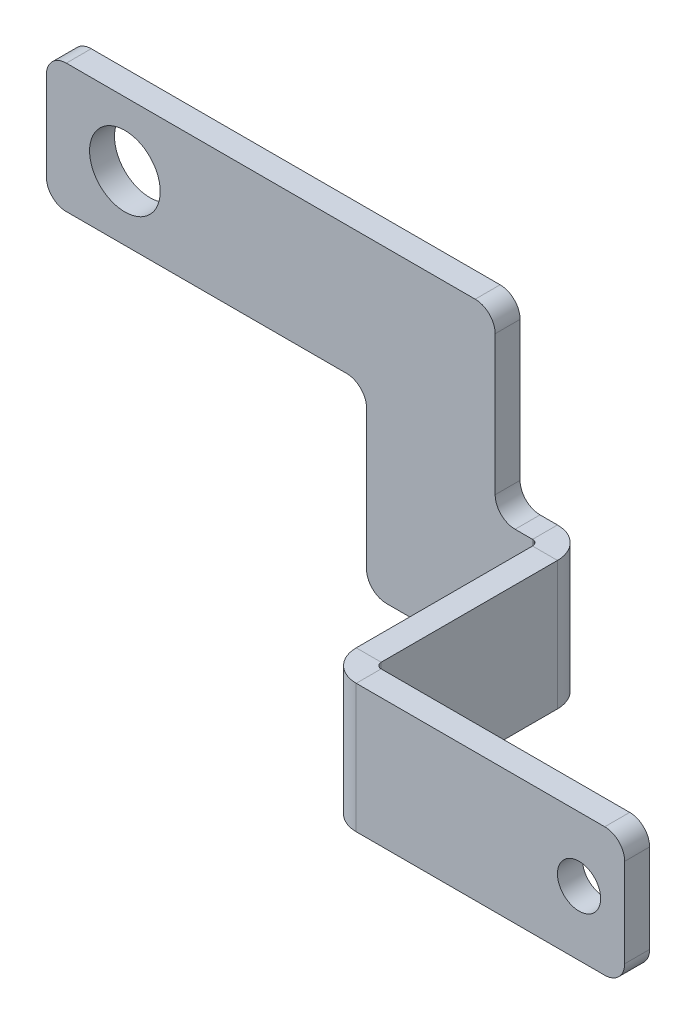
ISO-10303-21;
HEADER;
FILE_DESCRIPTION(('STEP AP214'),'2;1');
FILE_NAME('part.step','',(''),(''),'','','');
FILE_SCHEMA(('AUTOMOTIVE_DESIGN { 1 0 10303 214 1 1 1 1 }'));
ENDSEC;
DATA;
#1=APPLICATION_CONTEXT('core data for automotive mechanical design processes');
#2=APPLICATION_PROTOCOL_DEFINITION('international standard','automotive_design',2000,#1);
#3=PRODUCT_CONTEXT('',#1,'mechanical');
#4=PRODUCT('Part','Part','',(#3));
#5=PRODUCT_RELATED_PRODUCT_CATEGORY('part','',(#4));
#6=PRODUCT_DEFINITION_FORMATION('','',#4);
#7=PRODUCT_DEFINITION_CONTEXT('part definition',#1,'design');
#8=PRODUCT_DEFINITION('design','',#6,#7);
#9=PRODUCT_DEFINITION_SHAPE('','',#8);
#10=(LENGTH_UNIT() NAMED_UNIT(*) SI_UNIT(.MILLI.,.METRE.));
#11=(NAMED_UNIT(*) PLANE_ANGLE_UNIT() SI_UNIT($,.RADIAN.));
#12=(NAMED_UNIT(*) SI_UNIT($,.STERADIAN.) SOLID_ANGLE_UNIT());
#13=UNCERTAINTY_MEASURE_WITH_UNIT(LENGTH_MEASURE(1.E-05),#10,'distance_accuracy_value','');
#14=(GEOMETRIC_REPRESENTATION_CONTEXT(3) GLOBAL_UNCERTAINTY_ASSIGNED_CONTEXT((#13)) GLOBAL_UNIT_ASSIGNED_CONTEXT((#10,
#11,#12)) REPRESENTATION_CONTEXT('',''));
#15=CARTESIAN_POINT('',(0.,0.,0.));
#16=DIRECTION('',(0.,0.,1.));
#17=DIRECTION('',(1.,0.,0.));
#18=AXIS2_PLACEMENT_3D('',#15,#16,#17);
#19=CARTESIAN_POINT('',(65.8241,-39.2125999999912,0.));
#20=DIRECTION('',(0.,1.,0.));
#21=DIRECTION('',(-1.,0.,0.));
#22=AXIS2_PLACEMENT_3D('',#19,#20,#21);
#23=PLANE('',#22);
#24=DIRECTION('',(-1.,0.,0.));
#25=VECTOR('',#24,1.);
#26=CARTESIAN_POINT('',(65.8241000000001,-39.2125999999912,23.1902));
#27=LINE('',#26,#25);
#28=CARTESIAN_POINT('',(65.8241000000001,-39.2125999999912,23.1902));
#29=VERTEX_POINT('',#28);
#30=CARTESIAN_POINT('',(62.6491000000001,-39.2125999999912,23.1902));
#31=VERTEX_POINT('',#30);
#32=EDGE_CURVE('E269',#29,#31,#27,.T.);
#33=ORIENTED_EDGE('',*,*,#32,.T.);
#34=DIRECTION('',(0.,0.,1.));
#35=VECTOR('',#34,1.);
#36=CARTESIAN_POINT('',(62.6491,-39.2125999999912,0.));
#37=LINE('',#36,#35);
#38=CARTESIAN_POINT('',(62.6491,-39.2125999999912,0.736599999999997));
#39=VERTEX_POINT('',#38);
#40=EDGE_CURVE('E290',#31,#39,#37,.F.);
#41=ORIENTED_EDGE('',*,*,#40,.T.);
#42=DIRECTION('',(-1.,0.,0.));
#43=VECTOR('',#42,1.);
#44=CARTESIAN_POINT('',(65.8241,-39.2125999999912,0.736599999999986));
#45=LINE('',#44,#43);
#46=CARTESIAN_POINT('',(65.8241,-39.2125999999912,0.736599999999986));
#47=VERTEX_POINT('',#46);
#48=EDGE_CURVE('E279',#39,#47,#45,.F.);
#49=ORIENTED_EDGE('',*,*,#48,.T.);
#50=DIRECTION('',(0.,0.,-1.));
#51=VECTOR('',#50,1.);
#52=CARTESIAN_POINT('',(65.8241,-39.2125999999912,-2.26544738483615E-13));
#53=LINE('',#52,#51);
#54=EDGE_CURVE('E285',#29,#47,#53,.T.);
#55=ORIENTED_EDGE('',*,*,#54,.F.);
#56=EDGE_LOOP('',(#33,#41,#49,#55));
#57=FACE_BOUND('',#56,.T.);
#58=ADVANCED_FACE('F58',(#57),#23,.F.);
#59=CARTESIAN_POINT('',(65.8241000000001,-22.8345999999912,23.9268));
#60=DIRECTION('',(0.,-1.,0.));
#61=DIRECTION('',(1.,0.,0.));
#62=AXIS2_PLACEMENT_3D('',#59,#60,#61);
#63=PLANE('',#62);
#64=DIRECTION('',(-1.,0.,0.));
#65=VECTOR('',#64,1.);
#66=CARTESIAN_POINT('',(65.8241000000001,-22.8345999999912,23.1902));
#67=LINE('',#66,#65);
#68=CARTESIAN_POINT('',(65.8241000000001,-22.8345999999912,23.1902));
#69=VERTEX_POINT('',#68);
#70=CARTESIAN_POINT('',(62.6491000000001,-22.8345999999912,23.1902));
#71=VERTEX_POINT('',#70);
#72=EDGE_CURVE('E276',#69,#71,#67,.T.);
#73=ORIENTED_EDGE('',*,*,#72,.F.);
#74=DIRECTION('',(0.,0.,1.));
#75=VECTOR('',#74,1.);
#76=CARTESIAN_POINT('',(65.8241,-22.8345999999912,-2.2985581365326E-13));
#77=LINE('',#76,#75);
#78=CARTESIAN_POINT('',(65.8241,-22.8345999999912,0.736599999999986));
#79=VERTEX_POINT('',#78);
#80=EDGE_CURVE('E281',#79,#69,#77,.T.);
#81=ORIENTED_EDGE('',*,*,#80,.F.);
#82=DIRECTION('',(-1.,0.,0.));
#83=VECTOR('',#82,1.);
#84=CARTESIAN_POINT('',(62.6491,-22.8345999999912,0.736599999999997));
#85=LINE('',#84,#83);
#86=CARTESIAN_POINT('',(62.6491,-22.8345999999912,0.736599999999997));
#87=VERTEX_POINT('',#86);
#88=EDGE_CURVE('E295',#87,#79,#85,.F.);
#89=ORIENTED_EDGE('',*,*,#88,.F.);
#90=DIRECTION('',(0.,0.,-1.));
#91=VECTOR('',#90,1.);
#92=CARTESIAN_POINT('',(62.6491000000001,-22.8345999999912,23.9268));
#93=LINE('',#92,#91);
#94=EDGE_CURVE('E287',#87,#71,#93,.F.);
#95=ORIENTED_EDGE('',*,*,#94,.T.);
#96=EDGE_LOOP('',(#73,#81,#89,#95));
#97=FACE_BOUND('',#96,.T.);
#98=ADVANCED_FACE('F470',(#97),#63,.F.);
#99=CARTESIAN_POINT('',(65.8241,0.,-2.26544738483615E-13));
#100=DIRECTION('',(-1.,0.,0.));
#101=DIRECTION('',(0.,0.,1.));
#102=AXIS2_PLACEMENT_3D('',#99,#100,#101);
#103=PLANE('',#102);
#104=DIRECTION('',(0.,-1.,0.));
#105=VECTOR('',#104,1.);
#106=CARTESIAN_POINT('',(65.8241000000001,-39.2125999999912,23.1902));
#107=LINE('',#106,#105);
#108=EDGE_CURVE('E273',#29,#69,#107,.F.);
#109=ORIENTED_EDGE('',*,*,#108,.F.);
#110=ORIENTED_EDGE('',*,*,#54,.T.);
#111=DIRECTION('',(0.,1.,0.));
#112=VECTOR('',#111,1.);
#113=CARTESIAN_POINT('',(65.8241,-39.2125999999912,0.736599999999986));
#114=LINE('',#113,#112);
#115=EDGE_CURVE('E292',#79,#47,#114,.F.);
#116=ORIENTED_EDGE('',*,*,#115,.F.);
#117=ORIENTED_EDGE('',*,*,#80,.T.);
#118=EDGE_LOOP('',(#109,#110,#116,#117));
#119=FACE_BOUND('',#118,.T.);
#120=ADVANCED_FACE('F465',(#119),#103,.F.);
#121=CARTESIAN_POINT('',(62.6491,0.,-2.15459285232788E-13));
#122=DIRECTION('',(-1.,0.,0.));
#123=DIRECTION('',(0.,0.,1.));
#124=AXIS2_PLACEMENT_3D('',#121,#122,#123);
#125=PLANE('',#124);
#126=ORIENTED_EDGE('',*,*,#40,.F.);
#127=DIRECTION('',(0.,-1.,0.));
#128=VECTOR('',#127,1.);
#129=CARTESIAN_POINT('',(62.6491000000001,-39.2125999999912,23.1902));
#130=LINE('',#129,#128);
#131=EDGE_CURVE('E226',#31,#71,#130,.F.);
#132=ORIENTED_EDGE('',*,*,#131,.T.);
#133=ORIENTED_EDGE('',*,*,#94,.F.);
#134=DIRECTION('',(0.,1.,0.));
#135=VECTOR('',#134,1.);
#136=CARTESIAN_POINT('',(62.6491,-39.2125999999912,0.736599999999997));
#137=LINE('',#136,#135);
#138=EDGE_CURVE('E298',#39,#87,#137,.T.);
#139=ORIENTED_EDGE('',*,*,#138,.F.);
#140=EDGE_LOOP('',(#126,#132,#133,#139));
#141=FACE_BOUND('',#140,.T.);
#142=ADVANCED_FACE('F479',(#141),#125,.T.);
#143=CARTESIAN_POINT('',(0.,0.,-3.175));
#144=DIRECTION('',(-1.,0.,0.));
#145=DIRECTION('',(0.,-1.,0.));
#146=AXIS2_PLACEMENT_3D('',#143,#144,#145);
#147=PLANE('',#146);
#148=DIRECTION('',(0.,-1.,0.));
#149=VECTOR('',#148,1.);
#150=CARTESIAN_POINT('',(0.,0.,-3.175));
#151=LINE('',#150,#149);
#152=CARTESIAN_POINT('',(0.,-2.54,-3.175));
#153=VERTEX_POINT('',#152);
#154=CARTESIAN_POINT('',(0.,-13.838,-3.175));
#155=VERTEX_POINT('',#154);
#156=EDGE_CURVE('E320',#153,#155,#151,.T.);
#157=ORIENTED_EDGE('',*,*,#156,.T.);
#158=DIRECTION('',(0.,0.,1.));
#159=VECTOR('',#158,1.);
#160=CARTESIAN_POINT('',(0.,-13.838,-3.175));
#161=LINE('',#160,#159);
#162=CARTESIAN_POINT('',(0.,-13.838,0.));
#163=VERTEX_POINT('',#162);
#164=EDGE_CURVE('E399',#155,#163,#161,.T.);
#165=ORIENTED_EDGE('',*,*,#164,.T.);
#166=DIRECTION('',(0.,-1.,0.));
#167=VECTOR('',#166,1.);
#168=CARTESIAN_POINT('',(0.,0.,0.));
#169=LINE('',#168,#167);
#170=CARTESIAN_POINT('',(0.,-2.54,0.));
#171=VERTEX_POINT('',#170);
#172=EDGE_CURVE('E319',#171,#163,#169,.T.);
#173=ORIENTED_EDGE('',*,*,#172,.F.);
#174=DIRECTION('',(0.,0.,1.));
#175=VECTOR('',#174,1.);
#176=CARTESIAN_POINT('',(0.,-2.54,-3.175));
#177=LINE('',#176,#175);
#178=EDGE_CURVE('E397',#171,#153,#177,.F.);
#179=ORIENTED_EDGE('',*,*,#178,.T.);
#180=EDGE_LOOP('',(#157,#165,#173,#179));
#181=FACE_BOUND('',#180,.T.);
#182=ADVANCED_FACE('F520',(#181),#147,.T.);
#183=CARTESIAN_POINT('',(0.,0.,-3.175));
#184=DIRECTION('',(0.,1.,0.));
#185=DIRECTION('',(0.,0.,1.));
#186=AXIS2_PLACEMENT_3D('',#183,#184,#185);
#187=PLANE('',#186);
#188=DIRECTION('',(-1.,0.,0.));
#189=VECTOR('',#188,1.);
#190=CARTESIAN_POINT('',(0.,0.,-3.175));
#191=LINE('',#190,#189);
#192=CARTESIAN_POINT('',(54.61,0.,-3.175));
#193=VERTEX_POINT('',#192);
#194=CARTESIAN_POINT('',(2.54,0.,-3.175));
#195=VERTEX_POINT('',#194);
#196=EDGE_CURVE('E340',#193,#195,#191,.T.);
#197=ORIENTED_EDGE('',*,*,#196,.T.);
#198=DIRECTION('',(0.,0.,1.));
#199=VECTOR('',#198,1.);
#200=CARTESIAN_POINT('',(2.54,0.,-3.175));
#201=LINE('',#200,#199);
#202=CARTESIAN_POINT('',(2.54,0.,0.));
#203=VERTEX_POINT('',#202);
#204=EDGE_CURVE('E420',#195,#203,#201,.T.);
#205=ORIENTED_EDGE('',*,*,#204,.T.);
#206=DIRECTION('',(-1.,0.,0.));
#207=VECTOR('',#206,1.);
#208=CARTESIAN_POINT('',(0.,0.,0.));
#209=LINE('',#208,#207);
#210=CARTESIAN_POINT('',(54.61,0.,0.));
#211=VERTEX_POINT('',#210);
#212=EDGE_CURVE('E324',#211,#203,#209,.T.);
#213=ORIENTED_EDGE('',*,*,#212,.F.);
#214=DIRECTION('',(0.,0.,1.));
#215=VECTOR('',#214,1.);
#216=CARTESIAN_POINT('',(54.61,0.,-3.175));
#217=LINE('',#216,#215);
#218=EDGE_CURVE('E418',#211,#193,#217,.F.);
#219=ORIENTED_EDGE('',*,*,#218,.T.);
#220=EDGE_LOOP('',(#197,#205,#213,#219));
#221=FACE_BOUND('',#220,.T.);
#222=ADVANCED_FACE('F524',(#221),#187,.T.);
#223=CARTESIAN_POINT('',(57.15,0.,-3.175));
#224=DIRECTION('',(1.,0.,0.));
#225=DIRECTION('',(0.,0.,-1.));
#226=AXIS2_PLACEMENT_3D('',#223,#224,#225);
#227=PLANE('',#226);
#228=DIRECTION('',(0.,1.,0.));
#229=VECTOR('',#228,1.);
#230=CARTESIAN_POINT('',(57.15,-16.378,-3.175));
#231=LINE('',#230,#229);
#232=CARTESIAN_POINT('',(57.15,-20.2945999999912,-3.175));
#233=VERTEX_POINT('',#232);
#234=CARTESIAN_POINT('',(57.15,-2.54,-3.175));
#235=VERTEX_POINT('',#234);
#236=EDGE_CURVE('E337',#233,#235,#231,.T.);
#237=ORIENTED_EDGE('',*,*,#236,.T.);
#238=DIRECTION('',(0.,0.,1.));
#239=VECTOR('',#238,1.);
#240=CARTESIAN_POINT('',(57.15,-2.54,-3.175));
#241=LINE('',#240,#239);
#242=CARTESIAN_POINT('',(57.15,-2.54,0.));
#243=VERTEX_POINT('',#242);
#244=EDGE_CURVE('E425',#235,#243,#241,.T.);
#245=ORIENTED_EDGE('',*,*,#244,.T.);
#246=DIRECTION('',(0.,1.,0.));
#247=VECTOR('',#246,1.);
#248=CARTESIAN_POINT('',(57.15,0.,0.));
#249=LINE('',#248,#247);
#250=CARTESIAN_POINT('',(57.15,-20.2945999999912,0.));
#251=VERTEX_POINT('',#250);
#252=EDGE_CURVE('E360',#251,#243,#249,.T.);
#253=ORIENTED_EDGE('',*,*,#252,.F.);
#254=DIRECTION('',(0.,0.,1.));
#255=VECTOR('',#254,1.);
#256=CARTESIAN_POINT('',(57.15,-20.2945999999912,-3.175));
#257=LINE('',#256,#255);
#258=EDGE_CURVE('E423',#251,#233,#257,.F.);
#259=ORIENTED_EDGE('',*,*,#258,.T.);
#260=EDGE_LOOP('',(#237,#245,#253,#259));
#261=FACE_BOUND('',#260,.T.);
#262=ADVANCED_FACE('F442',(#261),#227,.T.);
#263=CARTESIAN_POINT('',(57.15,-22.8345999999912,-3.175));
#264=DIRECTION('',(0.,1.,0.));
#265=DIRECTION('',(0.,0.,1.));
#266=AXIS2_PLACEMENT_3D('',#263,#264,#265);
#267=PLANE('',#266);
#268=DIRECTION('',(-1.,0.,0.));
#269=VECTOR('',#268,1.);
#270=CARTESIAN_POINT('',(57.15,-22.8345999999912,-3.175));
#271=LINE('',#270,#269);
#272=CARTESIAN_POINT('',(61.9125,-22.8345999999912,-3.17500000000002));
#273=VERTEX_POINT('',#272);
#274=CARTESIAN_POINT('',(59.69,-22.8345999999912,-3.175));
#275=VERTEX_POINT('',#274);
#276=EDGE_CURVE('E335',#273,#275,#271,.T.);
#277=ORIENTED_EDGE('',*,*,#276,.T.);
#278=DIRECTION('',(0.,0.,1.));
#279=VECTOR('',#278,1.);
#280=CARTESIAN_POINT('',(59.69,-22.8345999999912,0.));
#281=LINE('',#280,#279);
#282=CARTESIAN_POINT('',(59.69,-22.8345999999912,0.));
#283=VERTEX_POINT('',#282);
#284=EDGE_CURVE('E428',#275,#283,#281,.T.);
#285=ORIENTED_EDGE('',*,*,#284,.T.);
#286=DIRECTION('',(-1.,0.,0.));
#287=VECTOR('',#286,1.);
#288=CARTESIAN_POINT('',(57.15,-22.8345999999912,0.));
#289=LINE('',#288,#287);
#290=CARTESIAN_POINT('',(61.9125,-22.8345999999912,0.));
#291=VERTEX_POINT('',#290);
#292=EDGE_CURVE('E357',#291,#283,#289,.T.);
#293=ORIENTED_EDGE('',*,*,#292,.F.);
#294=DIRECTION('',(0.,0.,1.));
#295=VECTOR('',#294,1.);
#296=CARTESIAN_POINT('',(61.9125,-22.8345999999912,-3.175));
#297=LINE('',#296,#295);
#298=EDGE_CURVE('E365',#273,#291,#297,.T.);
#299=ORIENTED_EDGE('',*,*,#298,.F.);
#300=EDGE_LOOP('',(#277,#285,#293,#299));
#301=FACE_BOUND('',#300,.T.);
#302=ADVANCED_FACE('F446',(#301),#267,.T.);
#303=CARTESIAN_POINT('',(57.15,-39.2125999999912,-3.175));
#304=DIRECTION('',(0.,-1.,0.));
#305=DIRECTION('',(0.,0.,-1.));
#306=AXIS2_PLACEMENT_3D('',#303,#304,#305);
#307=PLANE('',#306);
#308=DIRECTION('',(1.,0.,0.));
#309=VECTOR('',#308,1.);
#310=CARTESIAN_POINT('',(57.15,-39.2125999999912,0.));
#311=LINE('',#310,#309);
#312=CARTESIAN_POINT('',(43.312,-39.2125999999912,0.));
#313=VERTEX_POINT('',#312);
#314=CARTESIAN_POINT('',(61.9125,-39.2125999999912,0.));
#315=VERTEX_POINT('',#314);
#316=EDGE_CURVE('E352',#313,#315,#311,.T.);
#317=ORIENTED_EDGE('',*,*,#316,.F.);
#318=DIRECTION('',(0.,0.,1.));
#319=VECTOR('',#318,1.);
#320=CARTESIAN_POINT('',(43.312,-39.2125999999912,-3.175));
#321=LINE('',#320,#319);
#322=CARTESIAN_POINT('',(43.312,-39.2125999999912,-3.175));
#323=VERTEX_POINT('',#322);
#324=EDGE_CURVE('E73',#313,#323,#321,.F.);
#325=ORIENTED_EDGE('',*,*,#324,.T.);
#326=DIRECTION('',(1.,0.,0.));
#327=VECTOR('',#326,1.);
#328=CARTESIAN_POINT('',(57.15,-39.2125999999912,-3.175));
#329=LINE('',#328,#327);
#330=CARTESIAN_POINT('',(61.9125,-39.2125999999912,-3.175));
#331=VERTEX_POINT('',#330);
#332=EDGE_CURVE('E330',#323,#331,#329,.T.);
#333=ORIENTED_EDGE('',*,*,#332,.T.);
#334=DIRECTION('',(0.,0.,1.));
#335=VECTOR('',#334,1.);
#336=CARTESIAN_POINT('',(61.9125,-39.2125999999912,-3.175));
#337=LINE('',#336,#335);
#338=EDGE_CURVE('E343',#331,#315,#337,.T.);
#339=ORIENTED_EDGE('',*,*,#338,.T.);
#340=EDGE_LOOP('',(#317,#325,#333,#339));
#341=FACE_BOUND('',#340,.T.);
#342=ADVANCED_FACE('F589',(#341),#307,.T.);
#343=CARTESIAN_POINT('',(40.772,-16.378,-3.175));
#344=DIRECTION('',(-1.,0.,0.));
#345=DIRECTION('',(0.,0.,1.));
#346=AXIS2_PLACEMENT_3D('',#343,#344,#345);
#347=PLANE('',#346);
#348=DIRECTION('',(0.,-1.,0.));
#349=VECTOR('',#348,1.);
#350=CARTESIAN_POINT('',(40.772,-16.378,0.));
#351=LINE('',#350,#349);
#352=CARTESIAN_POINT('',(40.772,-18.918,0.));
#353=VERTEX_POINT('',#352);
#354=CARTESIAN_POINT('',(40.772,-36.6725999999912,0.));
#355=VERTEX_POINT('',#354);
#356=EDGE_CURVE('E349',#353,#355,#351,.T.);
#357=ORIENTED_EDGE('',*,*,#356,.F.);
#358=DIRECTION('',(0.,0.,1.));
#359=VECTOR('',#358,1.);
#360=CARTESIAN_POINT('',(40.772,-18.918,-3.175));
#361=LINE('',#360,#359);
#362=CARTESIAN_POINT('',(40.772,-18.918,-3.175));
#363=VERTEX_POINT('',#362);
#364=EDGE_CURVE('E378',#353,#363,#361,.F.);
#365=ORIENTED_EDGE('',*,*,#364,.T.);
#366=DIRECTION('',(0.,-1.,0.));
#367=VECTOR('',#366,1.);
#368=CARTESIAN_POINT('',(40.772,-16.378,-3.175));
#369=LINE('',#368,#367);
#370=CARTESIAN_POINT('',(40.772,-36.6725999999912,-3.175));
#371=VERTEX_POINT('',#370);
#372=EDGE_CURVE('E327',#363,#371,#369,.T.);
#373=ORIENTED_EDGE('',*,*,#372,.T.);
#374=DIRECTION('',(0.,0.,1.));
#375=VECTOR('',#374,1.);
#376=CARTESIAN_POINT('',(40.772,-36.6725999999912,-3.175));
#377=LINE('',#376,#375);
#378=EDGE_CURVE('E375',#371,#355,#377,.T.);
#379=ORIENTED_EDGE('',*,*,#378,.T.);
#380=EDGE_LOOP('',(#357,#365,#373,#379));
#381=FACE_BOUND('',#380,.T.);
#382=ADVANCED_FACE('F572',(#381),#347,.T.);
#383=CARTESIAN_POINT('',(0.,-16.378,-3.175));
#384=DIRECTION('',(0.,-1.,0.));
#385=DIRECTION('',(0.,0.,-1.));
#386=AXIS2_PLACEMENT_3D('',#383,#384,#385);
#387=PLANE('',#386);
#388=DIRECTION('',(1.,0.,0.));
#389=VECTOR('',#388,1.);
#390=CARTESIAN_POINT('',(0.,-16.378,-3.175));
#391=LINE('',#390,#389);
#392=CARTESIAN_POINT('',(2.54,-16.378,-3.175));
#393=VERTEX_POINT('',#392);
#394=CARTESIAN_POINT('',(38.232,-16.378,-3.175));
#395=VERTEX_POINT('',#394);
#396=EDGE_CURVE('E323',#393,#395,#391,.T.);
#397=ORIENTED_EDGE('',*,*,#396,.T.);
#398=DIRECTION('',(0.,0.,1.));
#399=VECTOR('',#398,1.);
#400=CARTESIAN_POINT('',(38.232,-16.378,0.));
#401=LINE('',#400,#399);
#402=CARTESIAN_POINT('',(38.232,-16.378,0.));
#403=VERTEX_POINT('',#402);
#404=EDGE_CURVE('E372',#395,#403,#401,.T.);
#405=ORIENTED_EDGE('',*,*,#404,.T.);
#406=DIRECTION('',(1.,0.,0.));
#407=VECTOR('',#406,1.);
#408=CARTESIAN_POINT('',(0.,-16.378,0.));
#409=LINE('',#408,#407);
#410=CARTESIAN_POINT('',(2.54,-16.378,0.));
#411=VERTEX_POINT('',#410);
#412=EDGE_CURVE('E346',#411,#403,#409,.T.);
#413=ORIENTED_EDGE('',*,*,#412,.F.);
#414=DIRECTION('',(0.,0.,1.));
#415=VECTOR('',#414,1.);
#416=CARTESIAN_POINT('',(2.54,-16.378,-3.175));
#417=LINE('',#416,#415);
#418=EDGE_CURVE('E368',#411,#393,#417,.F.);
#419=ORIENTED_EDGE('',*,*,#418,.T.);
#420=EDGE_LOOP('',(#397,#405,#413,#419));
#421=FACE_BOUND('',#420,.T.);
#422=ADVANCED_FACE('F534',(#421),#387,.T.);
#423=CARTESIAN_POINT('',(0.,0.,-3.175));
#424=DIRECTION('',(0.,0.,1.));
#425=DIRECTION('',(1.,0.,0.));
#426=AXIS2_PLACEMENT_3D('',#423,#424,#425);
#427=PLANE('',#426);
#428=CARTESIAN_POINT('',(10.,-8.189,-3.175));
#429=DIRECTION('',(0.,0.,1.));
#430=DIRECTION('',(1.,0.,0.));
#431=AXIS2_PLACEMENT_3D('',#428,#429,#430);
#432=CIRCLE('',#431,4.5);
#433=CARTESIAN_POINT('',(14.5,-8.189,-3.175));
#434=VERTEX_POINT('',#433);
#435=EDGE_CURVE('E316',#434,#434,#432,.T.);
#436=ORIENTED_EDGE('',*,*,#435,.T.);
#437=EDGE_LOOP('',(#436));
#438=FACE_BOUND('',#437,.T.);
#439=ORIENTED_EDGE('',*,*,#396,.F.);
#440=CARTESIAN_POINT('',(2.54,-13.838,-3.175));
#441=DIRECTION('',(0.,0.,1.));
#442=DIRECTION('',(1.,0.,0.));
#443=AXIS2_PLACEMENT_3D('',#440,#441,#442);
#444=CIRCLE('',#443,2.54);
#445=EDGE_CURVE('E416',#393,#155,#444,.F.);
#446=ORIENTED_EDGE('',*,*,#445,.T.);
#447=ORIENTED_EDGE('',*,*,#156,.F.);
#448=CARTESIAN_POINT('',(2.54,-2.54,-3.175));
#449=DIRECTION('',(0.,0.,1.));
#450=DIRECTION('',(1.,0.,0.));
#451=AXIS2_PLACEMENT_3D('',#448,#449,#450);
#452=CIRCLE('',#451,2.54);
#453=EDGE_CURVE('E414',#153,#195,#452,.F.);
#454=ORIENTED_EDGE('',*,*,#453,.T.);
#455=ORIENTED_EDGE('',*,*,#196,.F.);
#456=CARTESIAN_POINT('',(54.61,-2.54,-3.175));
#457=DIRECTION('',(0.,0.,1.));
#458=DIRECTION('',(1.,0.,0.));
#459=AXIS2_PLACEMENT_3D('',#456,#457,#458);
#460=CIRCLE('',#459,2.54);
#461=EDGE_CURVE('E412',#193,#235,#460,.F.);
#462=ORIENTED_EDGE('',*,*,#461,.T.);
#463=ORIENTED_EDGE('',*,*,#236,.F.);
#464=CARTESIAN_POINT('',(59.69,-20.2945999999912,-3.175));
#465=DIRECTION('',(0.,0.,1.));
#466=DIRECTION('',(1.,0.,0.));
#467=AXIS2_PLACEMENT_3D('',#464,#465,#466);
#468=CIRCLE('',#467,2.54);
#469=EDGE_CURVE('E13',#233,#275,#468,.T.);
#470=ORIENTED_EDGE('',*,*,#469,.T.);
#471=ORIENTED_EDGE('',*,*,#276,.F.);
#472=DIRECTION('',(0.,1.,0.));
#473=VECTOR('',#472,1.);
#474=CARTESIAN_POINT('',(61.9125,-39.2125999999912,-3.175));
#475=LINE('',#474,#473);
#476=EDGE_CURVE('E332',#331,#273,#475,.T.);
#477=ORIENTED_EDGE('',*,*,#476,.F.);
#478=ORIENTED_EDGE('',*,*,#332,.F.);
#479=CARTESIAN_POINT('',(43.312,-36.6725999999912,-3.175));
#480=DIRECTION('',(0.,0.,1.));
#481=DIRECTION('',(1.,0.,0.));
#482=AXIS2_PLACEMENT_3D('',#479,#480,#481);
#483=CIRCLE('',#482,2.54);
#484=EDGE_CURVE('E410',#323,#371,#483,.F.);
#485=ORIENTED_EDGE('',*,*,#484,.T.);
#486=ORIENTED_EDGE('',*,*,#372,.F.);
#487=CARTESIAN_POINT('',(38.232,-18.918,-3.175));
#488=DIRECTION('',(0.,0.,1.));
#489=DIRECTION('',(1.,0.,0.));
#490=AXIS2_PLACEMENT_3D('',#487,#488,#489);
#491=CIRCLE('',#490,2.54);
#492=EDGE_CURVE('E434',#363,#395,#491,.T.);
#493=ORIENTED_EDGE('',*,*,#492,.T.);
#494=EDGE_LOOP('',(#439,#446,#447,#454,#455,#462,#463,#470,#471,#477,#478,#485,#486,#493));
#495=FACE_BOUND('',#494,.T.);
#496=ADVANCED_FACE('F450',(#438,#495),#427,.F.);
#497=CARTESIAN_POINT('',(0.,0.,0.));
#498=DIRECTION('',(0.,0.,1.));
#499=DIRECTION('',(1.,0.,0.));
#500=AXIS2_PLACEMENT_3D('',#497,#498,#499);
#501=PLANE('',#500);
#502=CARTESIAN_POINT('',(10.,-8.189,0.));
#503=DIRECTION('',(0.,0.,1.));
#504=DIRECTION('',(1.,0.,0.));
#505=AXIS2_PLACEMENT_3D('',#502,#503,#504);
#506=CIRCLE('',#505,4.5);
#507=CARTESIAN_POINT('',(14.5,-8.189,0.));
#508=VERTEX_POINT('',#507);
#509=EDGE_CURVE('E305',#508,#508,#506,.T.);
#510=ORIENTED_EDGE('',*,*,#509,.F.);
#511=EDGE_LOOP('',(#510));
#512=FACE_BOUND('',#511,.T.);
#513=ORIENTED_EDGE('',*,*,#172,.T.);
#514=CARTESIAN_POINT('',(2.54,-13.838,0.));
#515=DIRECTION('',(0.,0.,1.));
#516=DIRECTION('',(1.,0.,0.));
#517=AXIS2_PLACEMENT_3D('',#514,#515,#516);
#518=CIRCLE('',#517,2.54);
#519=EDGE_CURVE('E408',#163,#411,#518,.T.);
#520=ORIENTED_EDGE('',*,*,#519,.T.);
#521=ORIENTED_EDGE('',*,*,#412,.T.);
#522=CARTESIAN_POINT('',(38.232,-18.918,0.));
#523=DIRECTION('',(0.,0.,1.));
#524=DIRECTION('',(1.,0.,0.));
#525=AXIS2_PLACEMENT_3D('',#522,#523,#524);
#526=CIRCLE('',#525,2.54);
#527=EDGE_CURVE('E432',#403,#353,#526,.F.);
#528=ORIENTED_EDGE('',*,*,#527,.T.);
#529=ORIENTED_EDGE('',*,*,#356,.T.);
#530=CARTESIAN_POINT('',(43.312,-36.6725999999912,0.));
#531=DIRECTION('',(0.,0.,1.));
#532=DIRECTION('',(1.,0.,0.));
#533=AXIS2_PLACEMENT_3D('',#530,#531,#532);
#534=CIRCLE('',#533,2.54);
#535=EDGE_CURVE('E402',#355,#313,#534,.T.);
#536=ORIENTED_EDGE('',*,*,#535,.T.);
#537=ORIENTED_EDGE('',*,*,#316,.T.);
#538=DIRECTION('',(0.,1.,0.));
#539=VECTOR('',#538,1.);
#540=CARTESIAN_POINT('',(61.9125,-39.2125999999912,0.));
#541=LINE('',#540,#539);
#542=EDGE_CURVE('E354',#315,#291,#541,.T.);
#543=ORIENTED_EDGE('',*,*,#542,.T.);
#544=ORIENTED_EDGE('',*,*,#292,.T.);
#545=CARTESIAN_POINT('',(59.69,-20.2945999999912,0.));
#546=DIRECTION('',(0.,0.,1.));
#547=DIRECTION('',(1.,0.,0.));
#548=AXIS2_PLACEMENT_3D('',#545,#546,#547);
#549=CIRCLE('',#548,2.54);
#550=EDGE_CURVE('E66',#283,#251,#549,.F.);
#551=ORIENTED_EDGE('',*,*,#550,.T.);
#552=ORIENTED_EDGE('',*,*,#252,.T.);
#553=CARTESIAN_POINT('',(54.61,-2.54,0.));
#554=DIRECTION('',(0.,0.,1.));
#555=DIRECTION('',(1.,0.,0.));
#556=AXIS2_PLACEMENT_3D('',#553,#554,#555);
#557=CIRCLE('',#556,2.54);
#558=EDGE_CURVE('E404',#243,#211,#557,.T.);
#559=ORIENTED_EDGE('',*,*,#558,.T.);
#560=ORIENTED_EDGE('',*,*,#212,.T.);
#561=CARTESIAN_POINT('',(2.54,-2.54,0.));
#562=DIRECTION('',(0.,0.,1.));
#563=DIRECTION('',(1.,0.,0.));
#564=AXIS2_PLACEMENT_3D('',#561,#562,#563);
#565=CIRCLE('',#564,2.54);
#566=EDGE_CURVE('E406',#203,#171,#565,.T.);
#567=ORIENTED_EDGE('',*,*,#566,.T.);
#568=EDGE_LOOP('',(#513,#520,#521,#528,#529,#536,#537,#543,#544,#551,#552,#559,#560,#567));
#569=FACE_BOUND('',#568,.T.);
#570=ADVANCED_FACE('F437',(#512,#569),#501,.T.);
#571=CARTESIAN_POINT('',(10.,-8.189,0.));
#572=DIRECTION('',(0.,0.,1.));
#573=DIRECTION('',(1.,0.,0.));
#574=AXIS2_PLACEMENT_3D('',#571,#572,#573);
#575=CYLINDRICAL_SURFACE('',#574,4.5);
#576=ORIENTED_EDGE('',*,*,#435,.F.);
#577=EDGE_LOOP('',(#576));
#578=FACE_BOUND('',#577,.T.);
#579=ORIENTED_EDGE('',*,*,#509,.T.);
#580=EDGE_LOOP('',(#579));
#581=FACE_BOUND('',#580,.T.);
#582=ADVANCED_FACE('F494',(#578,#581),#575,.F.);
#583=CARTESIAN_POINT('',(61.9125,-39.2125999999912,0.7366));
#584=DIRECTION('',(0.,-1.,0.));
#585=DIRECTION('',(0.,0.,-1.));
#586=AXIS2_PLACEMENT_3D('',#583,#584,#585);
#587=PLANE('',#586);
#588=ORIENTED_EDGE('',*,*,#48,.F.);
#589=CARTESIAN_POINT('',(61.9125,-39.2125999999912,0.7366));
#590=DIRECTION('',(0.,1.,0.));
#591=DIRECTION('',(0.,0.,1.));
#592=AXIS2_PLACEMENT_3D('',#589,#590,#591);
#593=CIRCLE('',#592,0.736600000000018);
#594=EDGE_CURVE('E309',#315,#39,#593,.F.);
#595=ORIENTED_EDGE('',*,*,#594,.F.);
#596=ORIENTED_EDGE('',*,*,#338,.F.);
#597=CARTESIAN_POINT('',(61.9125,-39.2125999999912,0.7366));
#598=DIRECTION('',(0.,1.,0.));
#599=DIRECTION('',(0.,0.,1.));
#600=AXIS2_PLACEMENT_3D('',#597,#598,#599);
#601=CIRCLE('',#600,3.91160000000002);
#602=EDGE_CURVE('E302',#331,#47,#601,.F.);
#603=ORIENTED_EDGE('',*,*,#602,.T.);
#604=EDGE_LOOP('',(#588,#595,#596,#603));
#605=FACE_BOUND('',#604,.T.);
#606=ADVANCED_FACE('F458',(#605),#587,.T.);
#607=CARTESIAN_POINT('',(61.9125,-22.8345999999912,0.7366));
#608=DIRECTION('',(0.,-1.,0.));
#609=DIRECTION('',(0.,0.,-1.));
#610=AXIS2_PLACEMENT_3D('',#607,#608,#609);
#611=PLANE('',#610);
#612=CARTESIAN_POINT('',(61.9125,-22.8345999999912,0.7366));
#613=DIRECTION('',(0.,1.,0.));
#614=DIRECTION('',(0.,0.,1.));
#615=AXIS2_PLACEMENT_3D('',#612,#613,#614);
#616=CIRCLE('',#615,0.736600000000018);
#617=EDGE_CURVE('E284',#87,#291,#616,.T.);
#618=ORIENTED_EDGE('',*,*,#617,.F.);
#619=ORIENTED_EDGE('',*,*,#88,.T.);
#620=CARTESIAN_POINT('',(61.9125,-22.8345999999912,0.7366));
#621=DIRECTION('',(0.,1.,0.));
#622=DIRECTION('',(0.,0.,1.));
#623=AXIS2_PLACEMENT_3D('',#620,#621,#622);
#624=CIRCLE('',#623,3.91160000000002);
#625=EDGE_CURVE('E306',#79,#273,#624,.T.);
#626=ORIENTED_EDGE('',*,*,#625,.T.);
#627=ORIENTED_EDGE('',*,*,#298,.T.);
#628=EDGE_LOOP('',(#618,#619,#626,#627));
#629=FACE_BOUND('',#628,.T.);
#630=ADVANCED_FACE('F486',(#629),#611,.F.);
#631=CARTESIAN_POINT('',(61.9125,-22.8345999999912,0.7366));
#632=DIRECTION('',(0.,1.,0.));
#633=DIRECTION('',(1.,0.,0.));
#634=AXIS2_PLACEMENT_3D('',#631,#632,#633);
#635=CYLINDRICAL_SURFACE('',#634,3.91160000000002);
#636=ORIENTED_EDGE('',*,*,#476,.T.);
#637=ORIENTED_EDGE('',*,*,#625,.F.);
#638=ORIENTED_EDGE('',*,*,#115,.T.);
#639=ORIENTED_EDGE('',*,*,#602,.F.);
#640=EDGE_LOOP('',(#636,#637,#638,#639));
#641=FACE_BOUND('',#640,.T.);
#642=ADVANCED_FACE('F460',(#641),#635,.T.);
#643=CARTESIAN_POINT('',(61.9125,-22.8345999999912,0.7366));
#644=DIRECTION('',(0.,1.,0.));
#645=DIRECTION('',(1.,0.,0.));
#646=AXIS2_PLACEMENT_3D('',#643,#644,#645);
#647=CYLINDRICAL_SURFACE('',#646,0.736600000000018);
#648=ORIENTED_EDGE('',*,*,#542,.F.);
#649=ORIENTED_EDGE('',*,*,#594,.T.);
#650=ORIENTED_EDGE('',*,*,#138,.T.);
#651=ORIENTED_EDGE('',*,*,#617,.T.);
#652=EDGE_LOOP('',(#648,#649,#650,#651));
#653=FACE_BOUND('',#652,.T.);
#654=ADVANCED_FACE('F483',(#653),#647,.F.);
#655=CARTESIAN_POINT('',(66.5607000000001,-22.8345999999912,23.1902));
#656=DIRECTION('',(0.,1.,0.));
#657=DIRECTION('',(0.,0.,1.));
#658=AXIS2_PLACEMENT_3D('',#655,#656,#657);
#659=PLANE('',#658);
#660=DIRECTION('',(0.,0.,1.));
#661=VECTOR('',#660,1.);
#662=CARTESIAN_POINT('',(66.5607000000001,-22.8345999999912,23.9268));
#663=LINE('',#662,#661);
#664=CARTESIAN_POINT('',(66.5607000000001,-22.8345999999912,23.9268));
#665=VERTEX_POINT('',#664);
#666=CARTESIAN_POINT('',(66.5607000000001,-22.8345999999912,27.1018));
#667=VERTEX_POINT('',#666);
#668=EDGE_CURVE('E869',#665,#667,#663,.T.);
#669=ORIENTED_EDGE('',*,*,#668,.F.);
#670=CARTESIAN_POINT('',(66.5607000000001,-22.8345999999912,23.1902));
#671=DIRECTION('',(0.,-1.,0.));
#672=DIRECTION('',(0.,0.,-1.));
#673=AXIS2_PLACEMENT_3D('',#670,#671,#672);
#674=CIRCLE('',#673,0.736600000000004);
#675=EDGE_CURVE('E229',#69,#665,#674,.F.);
#676=ORIENTED_EDGE('',*,*,#675,.F.);
#677=ORIENTED_EDGE('',*,*,#72,.T.);
#678=CARTESIAN_POINT('',(66.5607000000001,-22.8345999999912,23.1902));
#679=DIRECTION('',(0.,-1.,0.));
#680=DIRECTION('',(0.,0.,-1.));
#681=AXIS2_PLACEMENT_3D('',#678,#679,#680);
#682=CIRCLE('',#681,3.9116);
#683=EDGE_CURVE('E268',#71,#667,#682,.F.);
#684=ORIENTED_EDGE('',*,*,#683,.T.);
#685=EDGE_LOOP('',(#669,#676,#677,#684));
#686=FACE_BOUND('',#685,.T.);
#687=ADVANCED_FACE('F475',(#686),#659,.T.);
#688=CARTESIAN_POINT('',(66.5607000000001,-39.2125999999912,23.1902));
#689=DIRECTION('',(0.,1.,0.));
#690=DIRECTION('',(0.,0.,1.));
#691=AXIS2_PLACEMENT_3D('',#688,#689,#690);
#692=PLANE('',#691);
#693=CARTESIAN_POINT('',(66.5607000000001,-39.2125999999912,23.1902));
#694=DIRECTION('',(0.,-1.,0.));
#695=DIRECTION('',(0.,0.,-1.));
#696=AXIS2_PLACEMENT_3D('',#693,#694,#695);
#697=CIRCLE('',#696,0.736600000000004);
#698=CARTESIAN_POINT('',(66.5607000000001,-39.2125999999912,23.9268));
#699=VERTEX_POINT('',#698);
#700=EDGE_CURVE('E236',#699,#29,#697,.T.);
#701=ORIENTED_EDGE('',*,*,#700,.F.);
#702=DIRECTION('',(0.,0.,1.));
#703=VECTOR('',#702,1.);
#704=CARTESIAN_POINT('',(66.5607000000001,-39.2125999999912,23.9268));
#705=LINE('',#704,#703);
#706=CARTESIAN_POINT('',(66.5607000000001,-39.2125999999912,27.1018));
#707=VERTEX_POINT('',#706);
#708=EDGE_CURVE('E233',#699,#707,#705,.T.);
#709=ORIENTED_EDGE('',*,*,#708,.T.);
#710=CARTESIAN_POINT('',(66.5607000000001,-39.2125999999912,23.1902));
#711=DIRECTION('',(0.,-1.,0.));
#712=DIRECTION('',(0.,0.,-1.));
#713=AXIS2_PLACEMENT_3D('',#710,#711,#712);
#714=CIRCLE('',#713,3.9116);
#715=EDGE_CURVE('E219',#707,#31,#714,.T.);
#716=ORIENTED_EDGE('',*,*,#715,.T.);
#717=ORIENTED_EDGE('',*,*,#32,.F.);
#718=EDGE_LOOP('',(#701,#709,#716,#717));
#719=FACE_BOUND('',#718,.T.);
#720=ADVANCED_FACE('F234',(#719),#692,.F.);
#721=CARTESIAN_POINT('',(66.5607000000001,-39.2125999999912,23.1902));
#722=DIRECTION('',(0.,-1.,0.));
#723=DIRECTION('',(0.,0.,1.));
#724=AXIS2_PLACEMENT_3D('',#721,#722,#723);
#725=CYLINDRICAL_SURFACE('',#724,3.9116);
#726=ORIENTED_EDGE('',*,*,#131,.F.);
#727=ORIENTED_EDGE('',*,*,#715,.F.);
#728=DIRECTION('',(0.,1.,0.));
#729=VECTOR('',#728,1.);
#730=CARTESIAN_POINT('',(66.5607000000001,0.,27.1018));
#731=LINE('',#730,#729);
#732=EDGE_CURVE('E223',#707,#667,#731,.T.);
#733=ORIENTED_EDGE('',*,*,#732,.T.);
#734=ORIENTED_EDGE('',*,*,#683,.F.);
#735=EDGE_LOOP('',(#726,#727,#733,#734));
#736=FACE_BOUND('',#735,.T.);
#737=ADVANCED_FACE('F221',(#736),#725,.T.);
#738=CARTESIAN_POINT('',(66.5607000000001,-39.2125999999912,23.1902));
#739=DIRECTION('',(0.,-1.,0.));
#740=DIRECTION('',(0.,0.,1.));
#741=AXIS2_PLACEMENT_3D('',#738,#739,#740);
#742=CYLINDRICAL_SURFACE('',#741,0.736600000000004);
#743=ORIENTED_EDGE('',*,*,#108,.T.);
#744=ORIENTED_EDGE('',*,*,#675,.T.);
#745=DIRECTION('',(0.,-1.,0.));
#746=VECTOR('',#745,1.);
#747=CARTESIAN_POINT('',(66.5607000000001,-22.8345999999912,23.9268));
#748=LINE('',#747,#746);
#749=EDGE_CURVE('E241',#665,#699,#748,.T.);
#750=ORIENTED_EDGE('',*,*,#749,.T.);
#751=ORIENTED_EDGE('',*,*,#700,.T.);
#752=EDGE_LOOP('',(#743,#744,#750,#751));
#753=FACE_BOUND('',#752,.T.);
#754=ADVANCED_FACE('F515',(#753),#742,.F.);
#755=CARTESIAN_POINT('',(65.8241000000001,-22.8345999999912,27.1018));
#756=DIRECTION('',(0.,-1.,0.));
#757=DIRECTION('',(0.,0.,-1.));
#758=AXIS2_PLACEMENT_3D('',#755,#756,#757);
#759=PLANE('',#758);
#760=DIRECTION('',(-1.,0.,0.));
#761=VECTOR('',#760,1.);
#762=CARTESIAN_POINT('',(65.8241000000001,-22.8345999999912,27.1018));
#763=LINE('',#762,#761);
#764=CARTESIAN_POINT('',(98.2091000000001,-22.8345999999912,27.1018));
#765=VERTEX_POINT('',#764);
#766=EDGE_CURVE('E250',#765,#667,#763,.T.);
#767=ORIENTED_EDGE('',*,*,#766,.F.);
#768=DIRECTION('',(0.,0.,-1.));
#769=VECTOR('',#768,1.);
#770=CARTESIAN_POINT('',(98.2091000000001,-22.8345999999912,27.1018));
#771=LINE('',#770,#769);
#772=CARTESIAN_POINT('',(98.2091000000001,-22.8345999999912,23.9268));
#773=VERTEX_POINT('',#772);
#774=EDGE_CURVE('E380',#765,#773,#771,.T.);
#775=ORIENTED_EDGE('',*,*,#774,.T.);
#776=DIRECTION('',(-1.,0.,0.));
#777=VECTOR('',#776,1.);
#778=CARTESIAN_POINT('',(65.8241000000001,-22.8345999999912,23.9268));
#779=LINE('',#778,#777);
#780=EDGE_CURVE('E251',#773,#665,#779,.T.);
#781=ORIENTED_EDGE('',*,*,#780,.T.);
#782=ORIENTED_EDGE('',*,*,#668,.T.);
#783=EDGE_LOOP('',(#767,#775,#781,#782));
#784=FACE_BOUND('',#783,.T.);
#785=ADVANCED_FACE('F685',(#784),#759,.F.);
#786=CARTESIAN_POINT('',(100.7491,-39.2125999999912,27.1018));
#787=DIRECTION('',(0.,1.,0.));
#788=DIRECTION('',(-1.,0.,0.));
#789=AXIS2_PLACEMENT_3D('',#786,#787,#788);
#790=PLANE('',#789);
#791=DIRECTION('',(1.,0.,0.));
#792=VECTOR('',#791,1.);
#793=CARTESIAN_POINT('',(100.7491,-39.2125999999912,23.9268));
#794=LINE('',#793,#792);
#795=CARTESIAN_POINT('',(98.2091000000001,-39.2125999999912,23.9268));
#796=VERTEX_POINT('',#795);
#797=EDGE_CURVE('E263',#699,#796,#794,.T.);
#798=ORIENTED_EDGE('',*,*,#797,.T.);
#799=DIRECTION('',(0.,0.,-1.));
#800=VECTOR('',#799,1.);
#801=CARTESIAN_POINT('',(98.2091000000001,-39.2125999999912,27.1018));
#802=LINE('',#801,#800);
#803=CARTESIAN_POINT('',(98.2091000000001,-39.2125999999912,27.1018));
#804=VERTEX_POINT('',#803);
#805=EDGE_CURVE('E255',#796,#804,#802,.F.);
#806=ORIENTED_EDGE('',*,*,#805,.T.);
#807=DIRECTION('',(1.,0.,0.));
#808=VECTOR('',#807,1.);
#809=CARTESIAN_POINT('',(100.7491,-39.2125999999912,27.1018));
#810=LINE('',#809,#808);
#811=EDGE_CURVE('E247',#707,#804,#810,.T.);
#812=ORIENTED_EDGE('',*,*,#811,.F.);
#813=ORIENTED_EDGE('',*,*,#708,.F.);
#814=EDGE_LOOP('',(#798,#806,#812,#813));
#815=FACE_BOUND('',#814,.T.);
#816=ADVANCED_FACE('F253',(#815),#790,.F.);
#817=CARTESIAN_POINT('',(0.,0.,27.1018));
#818=DIRECTION('',(0.,0.,-1.));
#819=DIRECTION('',(-1.,0.,0.));
#820=AXIS2_PLACEMENT_3D('',#817,#818,#819);
#821=PLANE('',#820);
#822=CARTESIAN_POINT('',(94.9349000000043,-31.0235999999912,27.1018));
#823=DIRECTION('',(0.,0.,1.));
#824=DIRECTION('',(1.,0.,0.));
#825=AXIS2_PLACEMENT_3D('',#822,#823,#824);
#826=CIRCLE('',#825,2.75);
#827=CARTESIAN_POINT('',(97.6849000000043,-31.0235999999912,27.1018));
#828=VERTEX_POINT('',#827);
#829=EDGE_CURVE('E874',#828,#828,#826,.T.);
#830=ORIENTED_EDGE('',*,*,#829,.F.);
#831=EDGE_LOOP('',(#830));
#832=FACE_BOUND('',#831,.T.);
#833=DIRECTION('',(0.,1.,0.));
#834=VECTOR('',#833,1.);
#835=CARTESIAN_POINT('',(100.7491,-22.8345999999912,27.1018));
#836=LINE('',#835,#834);
#837=CARTESIAN_POINT('',(100.7491,-36.6725999999912,27.1018));
#838=VERTEX_POINT('',#837);
#839=CARTESIAN_POINT('',(100.7491,-25.3745999999912,27.1018));
#840=VERTEX_POINT('',#839);
#841=EDGE_CURVE('E256',#838,#840,#836,.T.);
#842=ORIENTED_EDGE('',*,*,#841,.T.);
#843=CARTESIAN_POINT('',(98.2091000000001,-25.3745999999912,27.1018));
#844=DIRECTION('',(0.,0.,-1.));
#845=DIRECTION('',(-1.,0.,0.));
#846=AXIS2_PLACEMENT_3D('',#843,#844,#845);
#847=CIRCLE('',#846,2.54);
#848=EDGE_CURVE('E394',#840,#765,#847,.F.);
#849=ORIENTED_EDGE('',*,*,#848,.T.);
#850=ORIENTED_EDGE('',*,*,#766,.T.);
#851=ORIENTED_EDGE('',*,*,#732,.F.);
#852=ORIENTED_EDGE('',*,*,#811,.T.);
#853=CARTESIAN_POINT('',(98.2091000000001,-36.6725999999912,27.1018));
#854=DIRECTION('',(0.,0.,-1.));
#855=DIRECTION('',(-1.,0.,0.));
#856=AXIS2_PLACEMENT_3D('',#853,#854,#855);
#857=CIRCLE('',#856,2.54);
#858=EDGE_CURVE('E392',#804,#838,#857,.F.);
#859=ORIENTED_EDGE('',*,*,#858,.T.);
#860=EDGE_LOOP('',(#842,#849,#850,#851,#852,#859));
#861=FACE_BOUND('',#860,.T.);
#862=ADVANCED_FACE('F246',(#832,#861),#821,.F.);
#863=CARTESIAN_POINT('',(0.,0.,23.9268));
#864=DIRECTION('',(0.,0.,-1.));
#865=DIRECTION('',(-1.,0.,0.));
#866=AXIS2_PLACEMENT_3D('',#863,#864,#865);
#867=PLANE('',#866);
#868=CARTESIAN_POINT('',(94.9349000000043,-31.0235999999912,23.9268));
#869=DIRECTION('',(0.,0.,-1.));
#870=DIRECTION('',(-1.,0.,0.));
#871=AXIS2_PLACEMENT_3D('',#868,#869,#870);
#872=CIRCLE('',#871,2.75);
#873=CARTESIAN_POINT('',(92.1849000000043,-31.0235999999912,23.9268));
#874=VERTEX_POINT('',#873);
#875=EDGE_CURVE('E870',#874,#874,#872,.T.);
#876=ORIENTED_EDGE('',*,*,#875,.F.);
#877=EDGE_LOOP('',(#876));
#878=FACE_BOUND('',#877,.T.);
#879=ORIENTED_EDGE('',*,*,#780,.F.);
#880=CARTESIAN_POINT('',(98.2091000000001,-25.3745999999912,23.9268));
#881=DIRECTION('',(0.,0.,-1.));
#882=DIRECTION('',(-1.,0.,0.));
#883=AXIS2_PLACEMENT_3D('',#880,#881,#882);
#884=CIRCLE('',#883,2.54);
#885=CARTESIAN_POINT('',(100.7491,-25.3745999999912,23.9268));
#886=VERTEX_POINT('',#885);
#887=EDGE_CURVE('E385',#773,#886,#884,.T.);
#888=ORIENTED_EDGE('',*,*,#887,.T.);
#889=DIRECTION('',(0.,1.,0.));
#890=VECTOR('',#889,1.);
#891=CARTESIAN_POINT('',(100.7491,-22.8345999999912,23.9268));
#892=LINE('',#891,#890);
#893=CARTESIAN_POINT('',(100.7491,-36.6725999999912,23.9268));
#894=VERTEX_POINT('',#893);
#895=EDGE_CURVE('E259',#894,#886,#892,.T.);
#896=ORIENTED_EDGE('',*,*,#895,.F.);
#897=CARTESIAN_POINT('',(98.2091000000001,-36.6725999999912,23.9268));
#898=DIRECTION('',(0.,0.,-1.));
#899=DIRECTION('',(-1.,0.,0.));
#900=AXIS2_PLACEMENT_3D('',#897,#898,#899);
#901=CIRCLE('',#900,2.54);
#902=EDGE_CURVE('E383',#894,#796,#901,.T.);
#903=ORIENTED_EDGE('',*,*,#902,.T.);
#904=ORIENTED_EDGE('',*,*,#797,.F.);
#905=ORIENTED_EDGE('',*,*,#749,.F.);
#906=EDGE_LOOP('',(#879,#888,#896,#903,#904,#905));
#907=FACE_BOUND('',#906,.T.);
#908=ADVANCED_FACE('F785',(#878,#907),#867,.T.);
#909=CARTESIAN_POINT('',(100.7491,-22.8345999999912,27.1018));
#910=DIRECTION('',(-1.,0.,0.));
#911=DIRECTION('',(0.,0.,1.));
#912=AXIS2_PLACEMENT_3D('',#909,#910,#911);
#913=PLANE('',#912);
#914=ORIENTED_EDGE('',*,*,#895,.T.);
#915=DIRECTION('',(0.,0.,-1.));
#916=VECTOR('',#915,1.);
#917=CARTESIAN_POINT('',(100.7491,-25.3745999999912,27.1018));
#918=LINE('',#917,#916);
#919=EDGE_CURVE('E390',#886,#840,#918,.F.);
#920=ORIENTED_EDGE('',*,*,#919,.T.);
#921=ORIENTED_EDGE('',*,*,#841,.F.);
#922=DIRECTION('',(0.,0.,-1.));
#923=VECTOR('',#922,1.);
#924=CARTESIAN_POINT('',(100.7491,-36.6725999999912,27.1018));
#925=LINE('',#924,#923);
#926=EDGE_CURVE('E387',#838,#894,#925,.T.);
#927=ORIENTED_EDGE('',*,*,#926,.T.);
#928=EDGE_LOOP('',(#914,#920,#921,#927));
#929=FACE_BOUND('',#928,.T.);
#930=ADVANCED_FACE('F696',(#929),#913,.F.);
#931=CARTESIAN_POINT('',(94.9349000000043,-31.0235999999912,27.1018));
#932=DIRECTION('',(0.,0.,1.));
#933=DIRECTION('',(1.,0.,0.));
#934=AXIS2_PLACEMENT_3D('',#931,#932,#933);
#935=CYLINDRICAL_SURFACE('',#934,2.75);
#936=ORIENTED_EDGE('',*,*,#875,.T.);
#937=EDGE_LOOP('',(#936));
#938=FACE_BOUND('',#937,.T.);
#939=ORIENTED_EDGE('',*,*,#829,.T.);
#940=EDGE_LOOP('',(#939));
#941=FACE_BOUND('',#940,.T.);
#942=ADVANCED_FACE('F540',(#938,#941),#935,.F.);
#943=CARTESIAN_POINT('',(38.232,-18.918,-3.175));
#944=DIRECTION('',(0.,0.,-1.));
#945=DIRECTION('',(-1.,0.,0.));
#946=AXIS2_PLACEMENT_3D('',#943,#944,#945);
#947=CYLINDRICAL_SURFACE('',#946,2.54);
#948=ORIENTED_EDGE('',*,*,#492,.F.);
#949=ORIENTED_EDGE('',*,*,#364,.F.);
#950=ORIENTED_EDGE('',*,*,#527,.F.);
#951=ORIENTED_EDGE('',*,*,#404,.F.);
#952=EDGE_LOOP('',(#948,#949,#950,#951));
#953=FACE_BOUND('',#952,.T.);
#954=ADVANCED_FACE('F536',(#953),#947,.F.);
#955=CARTESIAN_POINT('',(98.2091000000001,-25.3745999999912,27.1018));
#956=DIRECTION('',(0.,0.,-1.));
#957=DIRECTION('',(-1.,0.,0.));
#958=AXIS2_PLACEMENT_3D('',#955,#956,#957);
#959=CYLINDRICAL_SURFACE('',#958,2.54);
#960=ORIENTED_EDGE('',*,*,#848,.F.);
#961=ORIENTED_EDGE('',*,*,#919,.F.);
#962=ORIENTED_EDGE('',*,*,#887,.F.);
#963=ORIENTED_EDGE('',*,*,#774,.F.);
#964=EDGE_LOOP('',(#960,#961,#962,#963));
#965=FACE_BOUND('',#964,.T.);
#966=ADVANCED_FACE('F539',(#965),#959,.T.);
#967=CARTESIAN_POINT('',(98.2091000000001,-36.6725999999912,27.1018));
#968=DIRECTION('',(0.,0.,-1.));
#969=DIRECTION('',(-1.,0.,0.));
#970=AXIS2_PLACEMENT_3D('',#967,#968,#969);
#971=CYLINDRICAL_SURFACE('',#970,2.54);
#972=ORIENTED_EDGE('',*,*,#858,.F.);
#973=ORIENTED_EDGE('',*,*,#805,.F.);
#974=ORIENTED_EDGE('',*,*,#902,.F.);
#975=ORIENTED_EDGE('',*,*,#926,.F.);
#976=EDGE_LOOP('',(#972,#973,#974,#975));
#977=FACE_BOUND('',#976,.T.);
#978=ADVANCED_FACE('F544',(#977),#971,.T.);
#979=CARTESIAN_POINT('',(2.54,-13.838,-3.175));
#980=DIRECTION('',(0.,0.,1.));
#981=DIRECTION('',(1.,0.,0.));
#982=AXIS2_PLACEMENT_3D('',#979,#980,#981);
#983=CYLINDRICAL_SURFACE('',#982,2.54);
#984=ORIENTED_EDGE('',*,*,#445,.F.);
#985=ORIENTED_EDGE('',*,*,#418,.F.);
#986=ORIENTED_EDGE('',*,*,#519,.F.);
#987=ORIENTED_EDGE('',*,*,#164,.F.);
#988=EDGE_LOOP('',(#984,#985,#986,#987));
#989=FACE_BOUND('',#988,.T.);
#990=ADVANCED_FACE('F548',(#989),#983,.T.);
#991=CARTESIAN_POINT('',(2.54,-2.54,-3.175));
#992=DIRECTION('',(0.,0.,1.));
#993=DIRECTION('',(1.,0.,0.));
#994=AXIS2_PLACEMENT_3D('',#991,#992,#993);
#995=CYLINDRICAL_SURFACE('',#994,2.54);
#996=ORIENTED_EDGE('',*,*,#453,.F.);
#997=ORIENTED_EDGE('',*,*,#178,.F.);
#998=ORIENTED_EDGE('',*,*,#566,.F.);
#999=ORIENTED_EDGE('',*,*,#204,.F.);
#1000=EDGE_LOOP('',(#996,#997,#998,#999));
#1001=FACE_BOUND('',#1000,.T.);
#1002=ADVANCED_FACE('F552',(#1001),#995,.T.);
#1003=CARTESIAN_POINT('',(54.61,-2.54,-3.175));
#1004=DIRECTION('',(0.,0.,1.));
#1005=DIRECTION('',(1.,0.,0.));
#1006=AXIS2_PLACEMENT_3D('',#1003,#1004,#1005);
#1007=CYLINDRICAL_SURFACE('',#1006,2.54);
#1008=ORIENTED_EDGE('',*,*,#461,.F.);
#1009=ORIENTED_EDGE('',*,*,#218,.F.);
#1010=ORIENTED_EDGE('',*,*,#558,.F.);
#1011=ORIENTED_EDGE('',*,*,#244,.F.);
#1012=EDGE_LOOP('',(#1008,#1009,#1010,#1011));
#1013=FACE_BOUND('',#1012,.T.);
#1014=ADVANCED_FACE('F556',(#1013),#1007,.T.);
#1015=CARTESIAN_POINT('',(59.69,-20.2945999999912,-3.175));
#1016=DIRECTION('',(0.,0.,-1.));
#1017=DIRECTION('',(-1.,0.,0.));
#1018=AXIS2_PLACEMENT_3D('',#1015,#1016,#1017);
#1019=CYLINDRICAL_SURFACE('',#1018,2.54);
#1020=ORIENTED_EDGE('',*,*,#469,.F.);
#1021=ORIENTED_EDGE('',*,*,#258,.F.);
#1022=ORIENTED_EDGE('',*,*,#550,.F.);
#1023=ORIENTED_EDGE('',*,*,#284,.F.);
#1024=EDGE_LOOP('',(#1020,#1021,#1022,#1023));
#1025=FACE_BOUND('',#1024,.T.);
#1026=ADVANCED_FACE('F444',(#1025),#1019,.F.);
#1027=CARTESIAN_POINT('',(43.312,-36.6725999999912,-3.175));
#1028=DIRECTION('',(0.,0.,1.));
#1029=DIRECTION('',(1.,0.,0.));
#1030=AXIS2_PLACEMENT_3D('',#1027,#1028,#1029);
#1031=CYLINDRICAL_SURFACE('',#1030,2.54);
#1032=ORIENTED_EDGE('',*,*,#484,.F.);
#1033=ORIENTED_EDGE('',*,*,#324,.F.);
#1034=ORIENTED_EDGE('',*,*,#535,.F.);
#1035=ORIENTED_EDGE('',*,*,#378,.F.);
#1036=EDGE_LOOP('',(#1032,#1033,#1034,#1035));
#1037=FACE_BOUND('',#1036,.T.);
#1038=ADVANCED_FACE('F60',(#1037),#1031,.T.);
#1039=CLOSED_SHELL('',(#58,#98,#120,#142,#182,#222,#262,#302,#342,#382,#422,#496,#570,#582,#606,
#630,#642,#654,#687,#720,#737,#754,#785,#816,#862,#908,#930,#942,#954,#966,#978,#990,#1002,
#1014,#1026,#1038));
#1040=MANIFOLD_SOLID_BREP('B2',#1039);
#1041=ADVANCED_BREP_SHAPE_REPRESENTATION('',(#18,#1040),#14);
#1042=SHAPE_DEFINITION_REPRESENTATION(#9,#1041);
ENDSEC;
END-ISO-10303-21;
